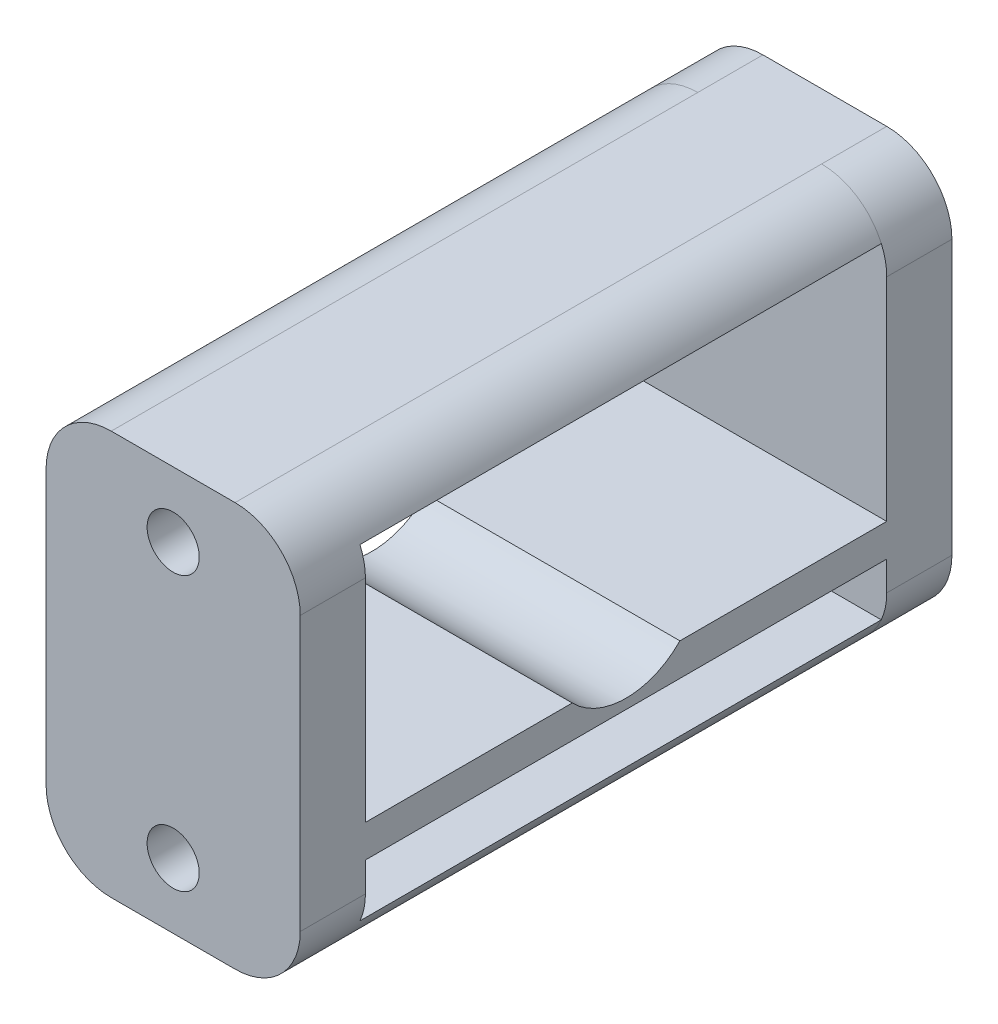
ISO-10303-21;
HEADER;
FILE_DESCRIPTION(('STEP AP214'),'2;1');
FILE_NAME('part.step','',(''),(''),'','','');
FILE_SCHEMA(('AUTOMOTIVE_DESIGN { 1 0 10303 214 1 1 1 1 }'));
ENDSEC;
DATA;
#1=APPLICATION_CONTEXT('core data for automotive mechanical design processes');
#2=APPLICATION_PROTOCOL_DEFINITION('international standard','automotive_design',2000,#1);
#3=PRODUCT_CONTEXT('',#1,'mechanical');
#4=PRODUCT('Part','Part','',(#3));
#5=PRODUCT_RELATED_PRODUCT_CATEGORY('part','',(#4));
#6=PRODUCT_DEFINITION_FORMATION('','',#4);
#7=PRODUCT_DEFINITION_CONTEXT('part definition',#1,'design');
#8=PRODUCT_DEFINITION('design','',#6,#7);
#9=PRODUCT_DEFINITION_SHAPE('','',#8);
#10=(LENGTH_UNIT() NAMED_UNIT(*) SI_UNIT(.MILLI.,.METRE.));
#11=(NAMED_UNIT(*) PLANE_ANGLE_UNIT() SI_UNIT($,.RADIAN.));
#12=(NAMED_UNIT(*) SI_UNIT($,.STERADIAN.) SOLID_ANGLE_UNIT());
#13=UNCERTAINTY_MEASURE_WITH_UNIT(LENGTH_MEASURE(1.E-05),#10,'distance_accuracy_value','');
#14=(GEOMETRIC_REPRESENTATION_CONTEXT(3) GLOBAL_UNCERTAINTY_ASSIGNED_CONTEXT((#13)) GLOBAL_UNIT_ASSIGNED_CONTEXT((#10,
#11,#12)) REPRESENTATION_CONTEXT('',''));
#15=CARTESIAN_POINT('',(0.,0.,0.));
#16=DIRECTION('',(0.,0.,1.));
#17=DIRECTION('',(1.,0.,0.));
#18=AXIS2_PLACEMENT_3D('',#15,#16,#17);
#19=CARTESIAN_POINT('',(19.5,-11.5,9.99999999999999));
#20=DIRECTION('',(0.,-1.,0.));
#21=DIRECTION('',(0.,0.,-1.));
#22=AXIS2_PLACEMENT_3D('',#19,#20,#21);
#23=PLANE('',#22);
#24=DIRECTION('',(0.,0.,1.));
#25=VECTOR('',#24,1.);
#26=CARTESIAN_POINT('',(19.5,-11.5,9.99999999999999));
#27=LINE('',#26,#25);
#28=CARTESIAN_POINT('',(19.5,-11.5,58.2613558209292));
#29=VERTEX_POINT('',#28);
#30=CARTESIAN_POINT('',(19.5,-11.5,90.));
#31=VERTEX_POINT('',#30);
#32=EDGE_CURVE('E409',#29,#31,#27,.T.);
#33=ORIENTED_EDGE('',*,*,#32,.F.);
#34=DIRECTION('',(-1.,0.,0.));
#35=VECTOR('',#34,1.);
#36=CARTESIAN_POINT('',(19.5,-11.5,58.2613558209292));
#37=LINE('',#36,#35);
#38=CARTESIAN_POINT('',(-19.5,-11.5,58.2613558209292));
#39=VERTEX_POINT('',#38);
#40=EDGE_CURVE('E11',#29,#39,#37,.T.);
#41=ORIENTED_EDGE('',*,*,#40,.T.);
#42=DIRECTION('',(0.,0.,1.));
#43=VECTOR('',#42,1.);
#44=CARTESIAN_POINT('',(-19.5,-11.5,9.99999999999999));
#45=LINE('',#44,#43);
#46=CARTESIAN_POINT('',(-19.5,-11.5,90.));
#47=VERTEX_POINT('',#46);
#48=EDGE_CURVE('E222',#39,#47,#45,.T.);
#49=ORIENTED_EDGE('',*,*,#48,.T.);
#50=DIRECTION('',(1.,0.,0.));
#51=VECTOR('',#50,1.);
#52=CARTESIAN_POINT('',(19.5,-11.5,90.));
#53=LINE('',#52,#51);
#54=EDGE_CURVE('E468',#47,#31,#53,.T.);
#55=ORIENTED_EDGE('',*,*,#54,.T.);
#56=EDGE_LOOP('',(#33,#41,#49,#55));
#57=FACE_BOUND('',#56,.T.);
#58=ADVANCED_FACE('F37',(#57),#23,.F.);
#59=CARTESIAN_POINT('',(0.,0.,10.));
#60=DIRECTION('',(0.,0.,1.));
#61=DIRECTION('',(1.,0.,0.));
#62=AXIS2_PLACEMENT_3D('',#59,#60,#61);
#63=PLANE('',#62);
#64=DIRECTION('',(0.,1.,0.));
#65=VECTOR('',#64,1.);
#66=CARTESIAN_POINT('',(19.5,-31.,10.));
#67=LINE('',#66,#65);
#68=CARTESIAN_POINT('',(19.5,-21.,10.));
#69=VERTEX_POINT('',#68);
#70=CARTESIAN_POINT('',(19.5,-16.5,10.));
#71=VERTEX_POINT('',#70);
#72=EDGE_CURVE('E291',#69,#71,#67,.T.);
#73=ORIENTED_EDGE('',*,*,#72,.T.);
#74=DIRECTION('',(-1.,0.,0.));
#75=VECTOR('',#74,1.);
#76=CARTESIAN_POINT('',(19.5,-16.5,9.99999999999999));
#77=LINE('',#76,#75);
#78=CARTESIAN_POINT('',(-19.5,-16.5,10.));
#79=VERTEX_POINT('',#78);
#80=EDGE_CURVE('E470',#71,#79,#77,.T.);
#81=ORIENTED_EDGE('',*,*,#80,.T.);
#82=DIRECTION('',(0.,1.,0.));
#83=VECTOR('',#82,1.);
#84=CARTESIAN_POINT('',(-19.5,-31.,10.));
#85=LINE('',#84,#83);
#86=CARTESIAN_POINT('',(-19.5,-21.,10.));
#87=VERTEX_POINT('',#86);
#88=EDGE_CURVE('E294',#87,#79,#85,.T.);
#89=ORIENTED_EDGE('',*,*,#88,.F.);
#90=CARTESIAN_POINT('',(-9.5,-21.,10.));
#91=DIRECTION('',(0.,0.,1.));
#92=DIRECTION('',(1.,0.,0.));
#93=AXIS2_PLACEMENT_3D('',#90,#91,#92);
#94=CIRCLE('',#93,10.);
#95=CARTESIAN_POINT('',(-18.6651513899117,-25.,10.));
#96=VERTEX_POINT('',#95);
#97=EDGE_CURVE('E337',#87,#96,#94,.T.);
#98=ORIENTED_EDGE('',*,*,#97,.T.);
#99=DIRECTION('',(-1.,0.,0.));
#100=VECTOR('',#99,1.);
#101=CARTESIAN_POINT('',(0.,-25.,10.));
#102=LINE('',#101,#100);
#103=CARTESIAN_POINT('',(0.,-25.,10.));
#104=VERTEX_POINT('',#103);
#105=EDGE_CURVE('E260',#104,#96,#102,.T.);
#106=ORIENTED_EDGE('',*,*,#105,.F.);
#107=CARTESIAN_POINT('',(0.,-21.,10.));
#108=DIRECTION('',(0.,0.,1.));
#109=DIRECTION('',(1.,0.,0.));
#110=AXIS2_PLACEMENT_3D('',#107,#108,#109);
#111=CIRCLE('',#110,4.);
#112=EDGE_CURVE('E286',#104,#104,#111,.T.);
#113=ORIENTED_EDGE('',*,*,#112,.F.);
#114=CARTESIAN_POINT('',(18.6651513899117,-25.,10.));
#115=VERTEX_POINT('',#114);
#116=EDGE_CURVE('E263',#115,#104,#102,.T.);
#117=ORIENTED_EDGE('',*,*,#116,.F.);
#118=CARTESIAN_POINT('',(9.5,-21.,10.));
#119=DIRECTION('',(0.,0.,1.));
#120=DIRECTION('',(1.,0.,0.));
#121=AXIS2_PLACEMENT_3D('',#118,#119,#120);
#122=CIRCLE('',#121,10.);
#123=EDGE_CURVE('E333',#115,#69,#122,.T.);
#124=ORIENTED_EDGE('',*,*,#123,.T.);
#125=EDGE_LOOP('',(#73,#81,#89,#98,#106,#113,#117,#124));
#126=FACE_BOUND('',#125,.T.);
#127=ADVANCED_FACE('F477',(#126),#63,.T.);
#128=CARTESIAN_POINT('',(-19.5,-11.5,10.));
#129=VERTEX_POINT('',#128);
#130=CARTESIAN_POINT('',(-19.5,21.,10.));
#131=VERTEX_POINT('',#130);
#132=EDGE_CURVE('E60',#129,#131,#85,.T.);
#133=ORIENTED_EDGE('',*,*,#132,.F.);
#134=DIRECTION('',(1.,0.,0.));
#135=VECTOR('',#134,1.);
#136=CARTESIAN_POINT('',(19.5,-11.5,9.99999999999999));
#137=LINE('',#136,#135);
#138=CARTESIAN_POINT('',(19.5,-11.5,9.99999999999999));
#139=VERTEX_POINT('',#138);
#140=EDGE_CURVE('E225',#129,#139,#137,.T.);
#141=ORIENTED_EDGE('',*,*,#140,.T.);
#142=CARTESIAN_POINT('',(19.5,21.,10.));
#143=VERTEX_POINT('',#142);
#144=EDGE_CURVE('E293',#139,#143,#67,.T.);
#145=ORIENTED_EDGE('',*,*,#144,.T.);
#146=CARTESIAN_POINT('',(9.5,21.,10.));
#147=DIRECTION('',(0.,0.,1.));
#148=DIRECTION('',(1.,0.,0.));
#149=AXIS2_PLACEMENT_3D('',#146,#147,#148);
#150=CIRCLE('',#149,10.);
#151=CARTESIAN_POINT('',(18.6651513899117,25.,10.));
#152=VERTEX_POINT('',#151);
#153=EDGE_CURVE('E331',#143,#152,#150,.T.);
#154=ORIENTED_EDGE('',*,*,#153,.T.);
#155=DIRECTION('',(1.,0.,0.));
#156=VECTOR('',#155,1.);
#157=CARTESIAN_POINT('',(0.,25.,10.));
#158=LINE('',#157,#156);
#159=CARTESIAN_POINT('',(0.,25.,10.));
#160=VERTEX_POINT('',#159);
#161=EDGE_CURVE('E278',#160,#152,#158,.T.);
#162=ORIENTED_EDGE('',*,*,#161,.F.);
#163=CARTESIAN_POINT('',(0.,21.,10.));
#164=DIRECTION('',(0.,0.,1.));
#165=DIRECTION('',(1.,0.,0.));
#166=AXIS2_PLACEMENT_3D('',#163,#164,#165);
#167=CIRCLE('',#166,4.);
#168=EDGE_CURVE('E283',#160,#160,#167,.T.);
#169=ORIENTED_EDGE('',*,*,#168,.F.);
#170=CARTESIAN_POINT('',(-18.6651513899117,25.,10.));
#171=VERTEX_POINT('',#170);
#172=EDGE_CURVE('E274',#171,#160,#158,.T.);
#173=ORIENTED_EDGE('',*,*,#172,.F.);
#174=CARTESIAN_POINT('',(-9.5,21.,10.));
#175=DIRECTION('',(0.,0.,1.));
#176=DIRECTION('',(1.,0.,0.));
#177=AXIS2_PLACEMENT_3D('',#174,#175,#176);
#178=CIRCLE('',#177,10.);
#179=EDGE_CURVE('E326',#171,#131,#178,.T.);
#180=ORIENTED_EDGE('',*,*,#179,.T.);
#181=EDGE_LOOP('',(#133,#141,#145,#154,#162,#169,#173,#180));
#182=FACE_BOUND('',#181,.T.);
#183=ADVANCED_FACE('F499',(#182),#63,.T.);
#184=CARTESIAN_POINT('',(0.,0.,90.));
#185=DIRECTION('',(0.,0.,-1.));
#186=DIRECTION('',(-1.,0.,0.));
#187=AXIS2_PLACEMENT_3D('',#184,#185,#186);
#188=PLANE('',#187);
#189=DIRECTION('',(0.,-1.,0.));
#190=VECTOR('',#189,1.);
#191=CARTESIAN_POINT('',(-19.5,-31.,90.));
#192=LINE('',#191,#190);
#193=CARTESIAN_POINT('',(-19.5,-16.5,90.));
#194=VERTEX_POINT('',#193);
#195=CARTESIAN_POINT('',(-19.5,-21.,90.));
#196=VERTEX_POINT('',#195);
#197=EDGE_CURVE('E257',#194,#196,#192,.T.);
#198=ORIENTED_EDGE('',*,*,#197,.F.);
#199=DIRECTION('',(-1.,0.,0.));
#200=VECTOR('',#199,1.);
#201=CARTESIAN_POINT('',(19.5,-16.5,90.));
#202=LINE('',#201,#200);
#203=CARTESIAN_POINT('',(19.5,-16.5,90.));
#204=VERTEX_POINT('',#203);
#205=EDGE_CURVE('E465',#204,#194,#202,.T.);
#206=ORIENTED_EDGE('',*,*,#205,.F.);
#207=DIRECTION('',(0.,1.,0.));
#208=VECTOR('',#207,1.);
#209=CARTESIAN_POINT('',(19.5,-31.,90.));
#210=LINE('',#209,#208);
#211=CARTESIAN_POINT('',(19.5,-21.,90.));
#212=VERTEX_POINT('',#211);
#213=EDGE_CURVE('E254',#212,#204,#210,.T.);
#214=ORIENTED_EDGE('',*,*,#213,.F.);
#215=CARTESIAN_POINT('',(9.5,-21.,90.));
#216=DIRECTION('',(0.,0.,-1.));
#217=DIRECTION('',(-1.,0.,0.));
#218=AXIS2_PLACEMENT_3D('',#215,#216,#217);
#219=CIRCLE('',#218,10.);
#220=CARTESIAN_POINT('',(18.6651513899117,-25.,90.));
#221=VERTEX_POINT('',#220);
#222=EDGE_CURVE('E363',#212,#221,#219,.T.);
#223=ORIENTED_EDGE('',*,*,#222,.T.);
#224=DIRECTION('',(-1.,0.,0.));
#225=VECTOR('',#224,1.);
#226=CARTESIAN_POINT('',(-19.5,-25.,90.));
#227=LINE('',#226,#225);
#228=CARTESIAN_POINT('',(0.,-25.,90.));
#229=VERTEX_POINT('',#228);
#230=EDGE_CURVE('E264',#221,#229,#227,.T.);
#231=ORIENTED_EDGE('',*,*,#230,.T.);
#232=CARTESIAN_POINT('',(0.,-21.,90.));
#233=DIRECTION('',(0.,0.,-1.));
#234=DIRECTION('',(-1.,0.,0.));
#235=AXIS2_PLACEMENT_3D('',#232,#233,#234);
#236=CIRCLE('',#235,4.);
#237=EDGE_CURVE('E235',#229,#229,#236,.T.);
#238=ORIENTED_EDGE('',*,*,#237,.F.);
#239=CARTESIAN_POINT('',(-18.6651513899117,-25.,90.));
#240=VERTEX_POINT('',#239);
#241=EDGE_CURVE('E253',#229,#240,#227,.T.);
#242=ORIENTED_EDGE('',*,*,#241,.T.);
#243=CARTESIAN_POINT('',(-9.5,-21.,90.));
#244=DIRECTION('',(0.,0.,-1.));
#245=DIRECTION('',(-1.,0.,0.));
#246=AXIS2_PLACEMENT_3D('',#243,#244,#245);
#247=CIRCLE('',#246,10.);
#248=EDGE_CURVE('E360',#240,#196,#247,.T.);
#249=ORIENTED_EDGE('',*,*,#248,.T.);
#250=EDGE_LOOP('',(#198,#206,#214,#223,#231,#238,#242,#249));
#251=FACE_BOUND('',#250,.T.);
#252=ADVANCED_FACE('F462',(#251),#188,.T.);
#253=CARTESIAN_POINT('',(19.5,21.,90.));
#254=VERTEX_POINT('',#253);
#255=EDGE_CURVE('E258',#31,#254,#210,.T.);
#256=ORIENTED_EDGE('',*,*,#255,.F.);
#257=ORIENTED_EDGE('',*,*,#54,.F.);
#258=CARTESIAN_POINT('',(-19.5,21.,90.));
#259=VERTEX_POINT('',#258);
#260=EDGE_CURVE('E244',#259,#47,#192,.T.);
#261=ORIENTED_EDGE('',*,*,#260,.F.);
#262=CARTESIAN_POINT('',(-9.5,21.,90.));
#263=DIRECTION('',(0.,0.,-1.));
#264=DIRECTION('',(-1.,0.,0.));
#265=AXIS2_PLACEMENT_3D('',#262,#263,#264);
#266=CIRCLE('',#265,10.);
#267=CARTESIAN_POINT('',(-18.6651513899117,25.,90.));
#268=VERTEX_POINT('',#267);
#269=EDGE_CURVE('E355',#259,#268,#266,.T.);
#270=ORIENTED_EDGE('',*,*,#269,.T.);
#271=DIRECTION('',(1.,0.,0.));
#272=VECTOR('',#271,1.);
#273=CARTESIAN_POINT('',(-19.5,25.,90.));
#274=LINE('',#273,#272);
#275=CARTESIAN_POINT('',(0.,25.,90.));
#276=VERTEX_POINT('',#275);
#277=EDGE_CURVE('E270',#268,#276,#274,.T.);
#278=ORIENTED_EDGE('',*,*,#277,.T.);
#279=CARTESIAN_POINT('',(0.,21.,90.));
#280=DIRECTION('',(0.,0.,-1.));
#281=DIRECTION('',(-1.,0.,0.));
#282=AXIS2_PLACEMENT_3D('',#279,#280,#281);
#283=CIRCLE('',#282,4.);
#284=EDGE_CURVE('E236',#276,#276,#283,.T.);
#285=ORIENTED_EDGE('',*,*,#284,.F.);
#286=CARTESIAN_POINT('',(18.6651513899117,25.,90.));
#287=VERTEX_POINT('',#286);
#288=EDGE_CURVE('E269',#276,#287,#274,.T.);
#289=ORIENTED_EDGE('',*,*,#288,.T.);
#290=CARTESIAN_POINT('',(9.5,21.,90.));
#291=DIRECTION('',(0.,0.,-1.));
#292=DIRECTION('',(-1.,0.,0.));
#293=AXIS2_PLACEMENT_3D('',#290,#291,#292);
#294=CIRCLE('',#293,10.);
#295=EDGE_CURVE('E357',#287,#254,#294,.T.);
#296=ORIENTED_EDGE('',*,*,#295,.T.);
#297=EDGE_LOOP('',(#256,#257,#261,#270,#278,#285,#289,#296));
#298=FACE_BOUND('',#297,.T.);
#299=ADVANCED_FACE('F414',(#298),#188,.T.);
#300=CARTESIAN_POINT('',(-19.5,31.,10.));
#301=DIRECTION('',(0.,1.,0.));
#302=DIRECTION('',(0.,0.,1.));
#303=AXIS2_PLACEMENT_3D('',#300,#301,#302);
#304=PLANE('',#303);
#305=DIRECTION('',(-1.,0.,0.));
#306=VECTOR('',#305,1.);
#307=CARTESIAN_POINT('',(-19.5,31.,100.));
#308=LINE('',#307,#306);
#309=CARTESIAN_POINT('',(9.5,31.,100.));
#310=VERTEX_POINT('',#309);
#311=CARTESIAN_POINT('',(-9.5,31.,100.));
#312=VERTEX_POINT('',#311);
#313=EDGE_CURVE('E243',#310,#312,#308,.T.);
#314=ORIENTED_EDGE('',*,*,#313,.F.);
#315=DIRECTION('',(0.,0.,-1.));
#316=VECTOR('',#315,1.);
#317=CARTESIAN_POINT('',(9.5,31.,90.));
#318=LINE('',#317,#316);
#319=CARTESIAN_POINT('',(9.5,31.,10.));
#320=VERTEX_POINT('',#319);
#321=EDGE_CURVE('E390',#310,#320,#318,.T.);
#322=ORIENTED_EDGE('',*,*,#321,.T.);
#323=DIRECTION('',(0.,0.,-1.));
#324=VECTOR('',#323,1.);
#325=CARTESIAN_POINT('',(9.5,31.,0.));
#326=LINE('',#325,#324);
#327=CARTESIAN_POINT('',(9.5,31.,0.));
#328=VERTEX_POINT('',#327);
#329=EDGE_CURVE('E348',#320,#328,#326,.T.);
#330=ORIENTED_EDGE('',*,*,#329,.T.);
#331=DIRECTION('',(1.,0.,0.));
#332=VECTOR('',#331,1.);
#333=CARTESIAN_POINT('',(-19.5,31.,0.));
#334=LINE('',#333,#332);
#335=CARTESIAN_POINT('',(-9.5,31.,0.));
#336=VERTEX_POINT('',#335);
#337=EDGE_CURVE('E282',#336,#328,#334,.T.);
#338=ORIENTED_EDGE('',*,*,#337,.F.);
#339=DIRECTION('',(0.,0.,-1.));
#340=VECTOR('',#339,1.);
#341=CARTESIAN_POINT('',(-9.5,31.,10.));
#342=LINE('',#341,#340);
#343=CARTESIAN_POINT('',(-9.5,31.,10.));
#344=VERTEX_POINT('',#343);
#345=EDGE_CURVE('E346',#336,#344,#342,.F.);
#346=ORIENTED_EDGE('',*,*,#345,.T.);
#347=DIRECTION('',(0.,0.,-1.));
#348=VECTOR('',#347,1.);
#349=CARTESIAN_POINT('',(-9.5,31.,100.));
#350=LINE('',#349,#348);
#351=EDGE_CURVE('E388',#344,#312,#350,.F.);
#352=ORIENTED_EDGE('',*,*,#351,.T.);
#353=EDGE_LOOP('',(#314,#322,#330,#338,#346,#352));
#354=FACE_BOUND('',#353,.T.);
#355=ADVANCED_FACE('F427',(#354),#304,.T.);
#356=CARTESIAN_POINT('',(-19.5,-31.,10.));
#357=DIRECTION('',(-1.,0.,0.));
#358=DIRECTION('',(0.,0.,1.));
#359=AXIS2_PLACEMENT_3D('',#356,#357,#358);
#360=PLANE('',#359);
#361=CARTESIAN_POINT('',(-19.5,-3.5,50.));
#362=DIRECTION('',(-1.,0.,0.));
#363=DIRECTION('',(0.,0.,1.));
#364=AXIS2_PLACEMENT_3D('',#361,#362,#363);
#365=CIRCLE('',#364,11.5);
#366=CARTESIAN_POINT('',(-19.5,-11.5,41.7386441790709));
#367=VERTEX_POINT('',#366);
#368=EDGE_CURVE('E210',#367,#39,#365,.T.);
#369=ORIENTED_EDGE('',*,*,#368,.F.);
#370=EDGE_CURVE('E219',#129,#367,#45,.T.);
#371=ORIENTED_EDGE('',*,*,#370,.F.);
#372=ORIENTED_EDGE('',*,*,#132,.T.);
#373=DIRECTION('',(0.,0.,-1.));
#374=VECTOR('',#373,1.);
#375=CARTESIAN_POINT('',(-19.5,21.,10.));
#376=LINE('',#375,#374);
#377=CARTESIAN_POINT('',(-19.5,21.,0.));
#378=VERTEX_POINT('',#377);
#379=EDGE_CURVE('E321',#131,#378,#376,.T.);
#380=ORIENTED_EDGE('',*,*,#379,.T.);
#381=DIRECTION('',(0.,1.,0.));
#382=VECTOR('',#381,1.);
#383=CARTESIAN_POINT('',(-19.5,-31.,0.));
#384=LINE('',#383,#382);
#385=CARTESIAN_POINT('',(-19.5,-21.,0.));
#386=VERTEX_POINT('',#385);
#387=EDGE_CURVE('E306',#386,#378,#384,.T.);
#388=ORIENTED_EDGE('',*,*,#387,.F.);
#389=DIRECTION('',(0.,0.,-1.));
#390=VECTOR('',#389,1.);
#391=CARTESIAN_POINT('',(-19.5,-21.,10.));
#392=LINE('',#391,#390);
#393=EDGE_CURVE('E324',#386,#87,#392,.F.);
#394=ORIENTED_EDGE('',*,*,#393,.T.);
#395=ORIENTED_EDGE('',*,*,#88,.T.);
#396=DIRECTION('',(0.,0.,1.));
#397=VECTOR('',#396,1.);
#398=CARTESIAN_POINT('',(-19.5,-16.5,9.99999999999999));
#399=LINE('',#398,#397);
#400=EDGE_CURVE('E226',#79,#194,#399,.T.);
#401=ORIENTED_EDGE('',*,*,#400,.T.);
#402=ORIENTED_EDGE('',*,*,#197,.T.);
#403=DIRECTION('',(0.,0.,-1.));
#404=VECTOR('',#403,1.);
#405=CARTESIAN_POINT('',(-19.5,-21.,100.));
#406=LINE('',#405,#404);
#407=CARTESIAN_POINT('',(-19.5,-21.,100.));
#408=VERTEX_POINT('',#407);
#409=EDGE_CURVE('E386',#196,#408,#406,.F.);
#410=ORIENTED_EDGE('',*,*,#409,.T.);
#411=DIRECTION('',(0.,-1.,0.));
#412=VECTOR('',#411,1.);
#413=CARTESIAN_POINT('',(-19.5,-31.,100.));
#414=LINE('',#413,#412);
#415=CARTESIAN_POINT('',(-19.5,21.,100.));
#416=VERTEX_POINT('',#415);
#417=EDGE_CURVE('E247',#416,#408,#414,.T.);
#418=ORIENTED_EDGE('',*,*,#417,.F.);
#419=DIRECTION('',(0.,0.,-1.));
#420=VECTOR('',#419,1.);
#421=CARTESIAN_POINT('',(-19.5,21.,90.));
#422=LINE('',#421,#420);
#423=EDGE_CURVE('E383',#416,#259,#422,.T.);
#424=ORIENTED_EDGE('',*,*,#423,.T.);
#425=ORIENTED_EDGE('',*,*,#260,.T.);
#426=ORIENTED_EDGE('',*,*,#48,.F.);
#427=EDGE_LOOP('',(#369,#371,#372,#380,#388,#394,#395,#401,#402,#410,#418,#424,#425,#426));
#428=FACE_BOUND('',#427,.T.);
#429=ADVANCED_FACE('F218',(#428),#360,.T.);
#430=CARTESIAN_POINT('',(-19.5,-31.,10.));
#431=DIRECTION('',(0.,1.,0.));
#432=DIRECTION('',(0.,0.,1.));
#433=AXIS2_PLACEMENT_3D('',#430,#431,#432);
#434=PLANE('',#433);
#435=DIRECTION('',(0.,0.,-1.));
#436=VECTOR('',#435,1.);
#437=CARTESIAN_POINT('',(9.5,-31.,10.));
#438=LINE('',#437,#436);
#439=CARTESIAN_POINT('',(9.5,-31.,0.));
#440=VERTEX_POINT('',#439);
#441=CARTESIAN_POINT('',(9.5,-31.,10.));
#442=VERTEX_POINT('',#441);
#443=EDGE_CURVE('E297',#440,#442,#438,.F.);
#444=ORIENTED_EDGE('',*,*,#443,.T.);
#445=DIRECTION('',(0.,0.,-1.));
#446=VECTOR('',#445,1.);
#447=CARTESIAN_POINT('',(9.5,-31.,10.));
#448=LINE('',#447,#446);
#449=CARTESIAN_POINT('',(9.5,-31.,100.));
#450=VERTEX_POINT('',#449);
#451=EDGE_CURVE('E373',#442,#450,#448,.F.);
#452=ORIENTED_EDGE('',*,*,#451,.T.);
#453=DIRECTION('',(1.,0.,0.));
#454=VECTOR('',#453,1.);
#455=CARTESIAN_POINT('',(-19.5,-31.,100.));
#456=LINE('',#455,#454);
#457=CARTESIAN_POINT('',(-9.5,-31.,100.));
#458=VERTEX_POINT('',#457);
#459=EDGE_CURVE('E250',#458,#450,#456,.T.);
#460=ORIENTED_EDGE('',*,*,#459,.F.);
#461=DIRECTION('',(0.,0.,-1.));
#462=VECTOR('',#461,1.);
#463=CARTESIAN_POINT('',(-9.5,-31.,10.));
#464=LINE('',#463,#462);
#465=CARTESIAN_POINT('',(-9.5,-31.,10.));
#466=VERTEX_POINT('',#465);
#467=EDGE_CURVE('E370',#458,#466,#464,.T.);
#468=ORIENTED_EDGE('',*,*,#467,.T.);
#469=DIRECTION('',(0.,0.,-1.));
#470=VECTOR('',#469,1.);
#471=CARTESIAN_POINT('',(-9.5,-31.,0.));
#472=LINE('',#471,#470);
#473=CARTESIAN_POINT('',(-9.5,-31.,0.));
#474=VERTEX_POINT('',#473);
#475=EDGE_CURVE('E310',#466,#474,#472,.T.);
#476=ORIENTED_EDGE('',*,*,#475,.T.);
#477=DIRECTION('',(1.,0.,0.));
#478=VECTOR('',#477,1.);
#479=CARTESIAN_POINT('',(-19.5,-31.,0.));
#480=LINE('',#479,#478);
#481=EDGE_CURVE('E303',#474,#440,#480,.T.);
#482=ORIENTED_EDGE('',*,*,#481,.T.);
#483=EDGE_LOOP('',(#444,#452,#460,#468,#476,#482));
#484=FACE_BOUND('',#483,.T.);
#485=ADVANCED_FACE('F449',(#484),#434,.F.);
#486=CARTESIAN_POINT('',(19.5,-31.,10.));
#487=DIRECTION('',(-1.,0.,0.));
#488=DIRECTION('',(0.,0.,1.));
#489=AXIS2_PLACEMENT_3D('',#486,#487,#488);
#490=PLANE('',#489);
#491=CARTESIAN_POINT('',(19.5,-11.5,41.7386441790709));
#492=VERTEX_POINT('',#491);
#493=EDGE_CURVE('E230',#139,#492,#27,.T.);
#494=ORIENTED_EDGE('',*,*,#493,.T.);
#495=CARTESIAN_POINT('',(19.5,-3.5,50.));
#496=DIRECTION('',(-1.,0.,0.));
#497=DIRECTION('',(0.,0.,1.));
#498=AXIS2_PLACEMENT_3D('',#495,#496,#497);
#499=CIRCLE('',#498,11.5);
#500=EDGE_CURVE('E52',#492,#29,#499,.T.);
#501=ORIENTED_EDGE('',*,*,#500,.T.);
#502=ORIENTED_EDGE('',*,*,#32,.T.);
#503=ORIENTED_EDGE('',*,*,#255,.T.);
#504=DIRECTION('',(0.,0.,-1.));
#505=VECTOR('',#504,1.);
#506=CARTESIAN_POINT('',(19.5,21.,100.));
#507=LINE('',#506,#505);
#508=CARTESIAN_POINT('',(19.5,21.,100.));
#509=VERTEX_POINT('',#508);
#510=EDGE_CURVE('E277',#254,#509,#507,.F.);
#511=ORIENTED_EDGE('',*,*,#510,.T.);
#512=DIRECTION('',(0.,1.,0.));
#513=VECTOR('',#512,1.);
#514=CARTESIAN_POINT('',(19.5,-31.,100.));
#515=LINE('',#514,#513);
#516=CARTESIAN_POINT('',(19.5,-21.,100.));
#517=VERTEX_POINT('',#516);
#518=EDGE_CURVE('E240',#517,#509,#515,.T.);
#519=ORIENTED_EDGE('',*,*,#518,.F.);
#520=DIRECTION('',(0.,0.,-1.));
#521=VECTOR('',#520,1.);
#522=CARTESIAN_POINT('',(19.5,-21.,100.));
#523=LINE('',#522,#521);
#524=EDGE_CURVE('E352',#517,#212,#523,.T.);
#525=ORIENTED_EDGE('',*,*,#524,.T.);
#526=ORIENTED_EDGE('',*,*,#213,.T.);
#527=DIRECTION('',(0.,0.,1.));
#528=VECTOR('',#527,1.);
#529=CARTESIAN_POINT('',(19.5,-16.5,9.99999999999999));
#530=LINE('',#529,#528);
#531=EDGE_CURVE('E228',#71,#204,#530,.T.);
#532=ORIENTED_EDGE('',*,*,#531,.F.);
#533=ORIENTED_EDGE('',*,*,#72,.F.);
#534=DIRECTION('',(0.,0.,-1.));
#535=VECTOR('',#534,1.);
#536=CARTESIAN_POINT('',(19.5,-21.,10.));
#537=LINE('',#536,#535);
#538=CARTESIAN_POINT('',(19.5,-21.,0.));
#539=VERTEX_POINT('',#538);
#540=EDGE_CURVE('E343',#69,#539,#537,.T.);
#541=ORIENTED_EDGE('',*,*,#540,.T.);
#542=DIRECTION('',(0.,1.,0.));
#543=VECTOR('',#542,1.);
#544=CARTESIAN_POINT('',(19.5,-31.,0.));
#545=LINE('',#544,#543);
#546=CARTESIAN_POINT('',(19.5,21.,0.));
#547=VERTEX_POINT('',#546);
#548=EDGE_CURVE('E300',#539,#547,#545,.T.);
#549=ORIENTED_EDGE('',*,*,#548,.T.);
#550=DIRECTION('',(0.,0.,-1.));
#551=VECTOR('',#550,1.);
#552=CARTESIAN_POINT('',(19.5,21.,10.));
#553=LINE('',#552,#551);
#554=EDGE_CURVE('E340',#547,#143,#553,.F.);
#555=ORIENTED_EDGE('',*,*,#554,.T.);
#556=ORIENTED_EDGE('',*,*,#144,.F.);
#557=EDGE_LOOP('',(#494,#501,#502,#503,#511,#519,#525,#526,#532,#533,#541,#549,#555,#556));
#558=FACE_BOUND('',#557,.T.);
#559=ADVANCED_FACE('F405',(#558),#490,.F.);
#560=CARTESIAN_POINT('',(0.,0.,0.));
#561=DIRECTION('',(0.,0.,1.));
#562=DIRECTION('',(1.,0.,0.));
#563=AXIS2_PLACEMENT_3D('',#560,#561,#562);
#564=PLANE('',#563);
#565=CARTESIAN_POINT('',(0.,21.,0.));
#566=DIRECTION('',(0.,0.,1.));
#567=DIRECTION('',(1.,0.,0.));
#568=AXIS2_PLACEMENT_3D('',#565,#566,#567);
#569=CIRCLE('',#568,4.);
#570=CARTESIAN_POINT('',(4.,21.,0.));
#571=VERTEX_POINT('',#570);
#572=EDGE_CURVE('E279',#571,#571,#569,.T.);
#573=ORIENTED_EDGE('',*,*,#572,.T.);
#574=EDGE_LOOP('',(#573));
#575=FACE_BOUND('',#574,.T.);
#576=CARTESIAN_POINT('',(0.,-21.,0.));
#577=DIRECTION('',(0.,0.,1.));
#578=DIRECTION('',(1.,0.,0.));
#579=AXIS2_PLACEMENT_3D('',#576,#577,#578);
#580=CIRCLE('',#579,4.);
#581=CARTESIAN_POINT('',(4.,-21.,0.));
#582=VERTEX_POINT('',#581);
#583=EDGE_CURVE('E273',#582,#582,#580,.T.);
#584=ORIENTED_EDGE('',*,*,#583,.T.);
#585=EDGE_LOOP('',(#584));
#586=FACE_BOUND('',#585,.T.);
#587=ORIENTED_EDGE('',*,*,#481,.F.);
#588=CARTESIAN_POINT('',(-9.5,-21.,0.));
#589=DIRECTION('',(0.,0.,1.));
#590=DIRECTION('',(1.,0.,0.));
#591=AXIS2_PLACEMENT_3D('',#588,#589,#590);
#592=CIRCLE('',#591,10.);
#593=EDGE_CURVE('E319',#474,#386,#592,.F.);
#594=ORIENTED_EDGE('',*,*,#593,.T.);
#595=ORIENTED_EDGE('',*,*,#387,.T.);
#596=CARTESIAN_POINT('',(-9.5,21.,0.));
#597=DIRECTION('',(0.,0.,1.));
#598=DIRECTION('',(1.,0.,0.));
#599=AXIS2_PLACEMENT_3D('',#596,#597,#598);
#600=CIRCLE('',#599,10.);
#601=EDGE_CURVE('E313',#378,#336,#600,.F.);
#602=ORIENTED_EDGE('',*,*,#601,.T.);
#603=ORIENTED_EDGE('',*,*,#337,.T.);
#604=CARTESIAN_POINT('',(9.5,21.,0.));
#605=DIRECTION('',(0.,0.,1.));
#606=DIRECTION('',(1.,0.,0.));
#607=AXIS2_PLACEMENT_3D('',#604,#605,#606);
#608=CIRCLE('',#607,10.);
#609=EDGE_CURVE('E315',#328,#547,#608,.F.);
#610=ORIENTED_EDGE('',*,*,#609,.T.);
#611=ORIENTED_EDGE('',*,*,#548,.F.);
#612=CARTESIAN_POINT('',(9.5,-21.,0.));
#613=DIRECTION('',(0.,0.,1.));
#614=DIRECTION('',(1.,0.,0.));
#615=AXIS2_PLACEMENT_3D('',#612,#613,#614);
#616=CIRCLE('',#615,10.);
#617=EDGE_CURVE('E317',#539,#440,#616,.F.);
#618=ORIENTED_EDGE('',*,*,#617,.T.);
#619=EDGE_LOOP('',(#587,#594,#595,#602,#603,#610,#611,#618));
#620=FACE_BOUND('',#619,.T.);
#621=ADVANCED_FACE('F521',(#575,#586,#620),#564,.F.);
#622=CARTESIAN_POINT('',(0.,-21.,0.));
#623=DIRECTION('',(0.,0.,1.));
#624=DIRECTION('',(1.,0.,0.));
#625=AXIS2_PLACEMENT_3D('',#622,#623,#624);
#626=CYLINDRICAL_SURFACE('',#625,4.);
#627=ORIENTED_EDGE('',*,*,#583,.F.);
#628=EDGE_LOOP('',(#627));
#629=FACE_BOUND('',#628,.T.);
#630=ORIENTED_EDGE('',*,*,#112,.T.);
#631=EDGE_LOOP('',(#630));
#632=FACE_BOUND('',#631,.T.);
#633=ADVANCED_FACE('F724',(#629,#632),#626,.F.);
#634=CARTESIAN_POINT('',(0.,21.,0.));
#635=DIRECTION('',(0.,0.,1.));
#636=DIRECTION('',(1.,0.,0.));
#637=AXIS2_PLACEMENT_3D('',#634,#635,#636);
#638=CYLINDRICAL_SURFACE('',#637,4.);
#639=ORIENTED_EDGE('',*,*,#572,.F.);
#640=EDGE_LOOP('',(#639));
#641=FACE_BOUND('',#640,.T.);
#642=ORIENTED_EDGE('',*,*,#168,.T.);
#643=EDGE_LOOP('',(#642));
#644=FACE_BOUND('',#643,.T.);
#645=ADVANCED_FACE('F700',(#641,#644),#638,.F.);
#646=CARTESIAN_POINT('',(-9.5,-21.,10.));
#647=DIRECTION('',(0.,0.,1.));
#648=DIRECTION('',(1.,0.,0.));
#649=AXIS2_PLACEMENT_3D('',#646,#647,#648);
#650=CYLINDRICAL_SURFACE('',#649,10.);
#651=ORIENTED_EDGE('',*,*,#97,.F.);
#652=ORIENTED_EDGE('',*,*,#393,.F.);
#653=ORIENTED_EDGE('',*,*,#593,.F.);
#654=ORIENTED_EDGE('',*,*,#475,.F.);
#655=CARTESIAN_POINT('',(-9.5,-21.,10.));
#656=DIRECTION('',(0.,0.,-1.));
#657=DIRECTION('',(-1.,0.,0.));
#658=AXIS2_PLACEMENT_3D('',#655,#656,#657);
#659=CIRCLE('',#658,10.);
#660=EDGE_CURVE('E267',#96,#466,#659,.F.);
#661=ORIENTED_EDGE('',*,*,#660,.F.);
#662=EDGE_LOOP('',(#651,#652,#653,#654,#661));
#663=FACE_BOUND('',#662,.T.);
#664=ADVANCED_FACE('F689',(#663),#650,.T.);
#665=CARTESIAN_POINT('',(9.5,-21.,10.));
#666=DIRECTION('',(0.,0.,-1.));
#667=DIRECTION('',(-1.,0.,0.));
#668=AXIS2_PLACEMENT_3D('',#665,#666,#667);
#669=CYLINDRICAL_SURFACE('',#668,10.);
#670=EDGE_CURVE('E334',#442,#115,#122,.T.);
#671=ORIENTED_EDGE('',*,*,#670,.F.);
#672=ORIENTED_EDGE('',*,*,#443,.F.);
#673=ORIENTED_EDGE('',*,*,#617,.F.);
#674=ORIENTED_EDGE('',*,*,#540,.F.);
#675=ORIENTED_EDGE('',*,*,#123,.F.);
#676=EDGE_LOOP('',(#671,#672,#673,#674,#675));
#677=FACE_BOUND('',#676,.T.);
#678=ADVANCED_FACE('F678',(#677),#669,.T.);
#679=CARTESIAN_POINT('',(9.5,21.,10.));
#680=DIRECTION('',(0.,0.,1.));
#681=DIRECTION('',(1.,0.,0.));
#682=AXIS2_PLACEMENT_3D('',#679,#680,#681);
#683=CYLINDRICAL_SURFACE('',#682,10.);
#684=ORIENTED_EDGE('',*,*,#153,.F.);
#685=ORIENTED_EDGE('',*,*,#554,.F.);
#686=ORIENTED_EDGE('',*,*,#609,.F.);
#687=ORIENTED_EDGE('',*,*,#329,.F.);
#688=EDGE_CURVE('E330',#152,#320,#150,.T.);
#689=ORIENTED_EDGE('',*,*,#688,.F.);
#690=EDGE_LOOP('',(#684,#685,#686,#687,#689));
#691=FACE_BOUND('',#690,.T.);
#692=ADVANCED_FACE('F666',(#691),#683,.T.);
#693=CARTESIAN_POINT('',(-9.5,21.,10.));
#694=DIRECTION('',(0.,0.,-1.));
#695=DIRECTION('',(-1.,0.,0.));
#696=AXIS2_PLACEMENT_3D('',#693,#694,#695);
#697=CYLINDRICAL_SURFACE('',#696,10.);
#698=EDGE_CURVE('E327',#344,#171,#178,.T.);
#699=ORIENTED_EDGE('',*,*,#698,.F.);
#700=ORIENTED_EDGE('',*,*,#345,.F.);
#701=ORIENTED_EDGE('',*,*,#601,.F.);
#702=ORIENTED_EDGE('',*,*,#379,.F.);
#703=ORIENTED_EDGE('',*,*,#179,.F.);
#704=EDGE_LOOP('',(#699,#700,#701,#702,#703));
#705=FACE_BOUND('',#704,.T.);
#706=ADVANCED_FACE('F625',(#705),#697,.T.);
#707=CARTESIAN_POINT('',(0.,25.,90.));
#708=DIRECTION('',(0.,1.,0.));
#709=DIRECTION('',(0.,0.,1.));
#710=AXIS2_PLACEMENT_3D('',#707,#708,#709);
#711=PLANE('',#710);
#712=ORIENTED_EDGE('',*,*,#161,.T.);
#713=DIRECTION('',(0.,0.,1.));
#714=VECTOR('',#713,1.);
#715=CARTESIAN_POINT('',(18.6651513899117,25.,10.));
#716=LINE('',#715,#714);
#717=EDGE_CURVE('E215',#152,#287,#716,.T.);
#718=ORIENTED_EDGE('',*,*,#717,.T.);
#719=ORIENTED_EDGE('',*,*,#288,.F.);
#720=ORIENTED_EDGE('',*,*,#277,.F.);
#721=DIRECTION('',(0.,0.,1.));
#722=VECTOR('',#721,1.);
#723=CARTESIAN_POINT('',(-18.6651513899117,25.,90.));
#724=LINE('',#723,#722);
#725=EDGE_CURVE('E393',#268,#171,#724,.F.);
#726=ORIENTED_EDGE('',*,*,#725,.T.);
#727=ORIENTED_EDGE('',*,*,#172,.T.);
#728=EDGE_LOOP('',(#712,#718,#719,#720,#726,#727));
#729=FACE_BOUND('',#728,.T.);
#730=ADVANCED_FACE('F613',(#729),#711,.F.);
#731=CARTESIAN_POINT('',(0.,-25.,90.));
#732=DIRECTION('',(0.,-1.,0.));
#733=DIRECTION('',(0.,0.,-1.));
#734=AXIS2_PLACEMENT_3D('',#731,#732,#733);
#735=PLANE('',#734);
#736=ORIENTED_EDGE('',*,*,#230,.F.);
#737=DIRECTION('',(0.,0.,-1.));
#738=VECTOR('',#737,1.);
#739=CARTESIAN_POINT('',(18.6651513899117,-25.,90.));
#740=LINE('',#739,#738);
#741=EDGE_CURVE('E368',#221,#115,#740,.T.);
#742=ORIENTED_EDGE('',*,*,#741,.T.);
#743=ORIENTED_EDGE('',*,*,#116,.T.);
#744=ORIENTED_EDGE('',*,*,#105,.T.);
#745=DIRECTION('',(0.,0.,-1.));
#746=VECTOR('',#745,1.);
#747=CARTESIAN_POINT('',(-18.6651513899117,-25.,10.));
#748=LINE('',#747,#746);
#749=EDGE_CURVE('E365',#96,#240,#748,.F.);
#750=ORIENTED_EDGE('',*,*,#749,.T.);
#751=ORIENTED_EDGE('',*,*,#241,.F.);
#752=EDGE_LOOP('',(#736,#742,#743,#744,#750,#751));
#753=FACE_BOUND('',#752,.T.);
#754=ADVANCED_FACE('F600',(#753),#735,.F.);
#755=CARTESIAN_POINT('',(0.,0.,100.));
#756=DIRECTION('',(0.,0.,-1.));
#757=DIRECTION('',(-1.,0.,0.));
#758=AXIS2_PLACEMENT_3D('',#755,#756,#757);
#759=PLANE('',#758);
#760=CARTESIAN_POINT('',(0.,21.,100.));
#761=DIRECTION('',(0.,0.,-1.));
#762=DIRECTION('',(-1.,0.,0.));
#763=AXIS2_PLACEMENT_3D('',#760,#761,#762);
#764=CIRCLE('',#763,4.);
#765=CARTESIAN_POINT('',(-4.,21.,100.));
#766=VERTEX_POINT('',#765);
#767=EDGE_CURVE('E399',#766,#766,#764,.T.);
#768=ORIENTED_EDGE('',*,*,#767,.T.);
#769=EDGE_LOOP('',(#768));
#770=FACE_BOUND('',#769,.T.);
#771=CARTESIAN_POINT('',(0.,-21.,100.));
#772=DIRECTION('',(0.,0.,-1.));
#773=DIRECTION('',(-1.,0.,0.));
#774=AXIS2_PLACEMENT_3D('',#771,#772,#773);
#775=CIRCLE('',#774,4.);
#776=CARTESIAN_POINT('',(-4.,-21.,100.));
#777=VERTEX_POINT('',#776);
#778=EDGE_CURVE('E238',#777,#777,#775,.T.);
#779=ORIENTED_EDGE('',*,*,#778,.T.);
#780=EDGE_LOOP('',(#779));
#781=FACE_BOUND('',#780,.T.);
#782=ORIENTED_EDGE('',*,*,#459,.T.);
#783=CARTESIAN_POINT('',(9.5,-21.,100.));
#784=DIRECTION('',(0.,0.,-1.));
#785=DIRECTION('',(-1.,0.,0.));
#786=AXIS2_PLACEMENT_3D('',#783,#784,#785);
#787=CIRCLE('',#786,10.);
#788=EDGE_CURVE('E381',#450,#517,#787,.F.);
#789=ORIENTED_EDGE('',*,*,#788,.T.);
#790=ORIENTED_EDGE('',*,*,#518,.T.);
#791=CARTESIAN_POINT('',(9.5,21.,100.));
#792=DIRECTION('',(0.,0.,-1.));
#793=DIRECTION('',(-1.,0.,0.));
#794=AXIS2_PLACEMENT_3D('',#791,#792,#793);
#795=CIRCLE('',#794,10.);
#796=EDGE_CURVE('E377',#509,#310,#795,.F.);
#797=ORIENTED_EDGE('',*,*,#796,.T.);
#798=ORIENTED_EDGE('',*,*,#313,.T.);
#799=CARTESIAN_POINT('',(-9.5,21.,100.));
#800=DIRECTION('',(0.,0.,-1.));
#801=DIRECTION('',(-1.,0.,0.));
#802=AXIS2_PLACEMENT_3D('',#799,#800,#801);
#803=CIRCLE('',#802,10.);
#804=EDGE_CURVE('E375',#312,#416,#803,.F.);
#805=ORIENTED_EDGE('',*,*,#804,.T.);
#806=ORIENTED_EDGE('',*,*,#417,.T.);
#807=CARTESIAN_POINT('',(-9.5,-21.,100.));
#808=DIRECTION('',(0.,0.,-1.));
#809=DIRECTION('',(-1.,0.,0.));
#810=AXIS2_PLACEMENT_3D('',#807,#808,#809);
#811=CIRCLE('',#810,10.);
#812=EDGE_CURVE('E379',#408,#458,#811,.F.);
#813=ORIENTED_EDGE('',*,*,#812,.T.);
#814=EDGE_LOOP('',(#782,#789,#790,#797,#798,#805,#806,#813));
#815=FACE_BOUND('',#814,.T.);
#816=ADVANCED_FACE('F424',(#770,#781,#815),#759,.F.);
#817=CARTESIAN_POINT('',(9.5,-21.,100.));
#818=DIRECTION('',(0.,0.,-1.));
#819=DIRECTION('',(-1.,0.,0.));
#820=AXIS2_PLACEMENT_3D('',#817,#818,#819);
#821=CYLINDRICAL_SURFACE('',#820,10.);
#822=ORIENTED_EDGE('',*,*,#788,.F.);
#823=ORIENTED_EDGE('',*,*,#451,.F.);
#824=ORIENTED_EDGE('',*,*,#670,.T.);
#825=ORIENTED_EDGE('',*,*,#741,.F.);
#826=ORIENTED_EDGE('',*,*,#222,.F.);
#827=ORIENTED_EDGE('',*,*,#524,.F.);
#828=EDGE_LOOP('',(#822,#823,#824,#825,#826,#827));
#829=FACE_BOUND('',#828,.T.);
#830=ADVANCED_FACE('F455',(#829),#821,.T.);
#831=CARTESIAN_POINT('',(-9.5,-21.,10.));
#832=DIRECTION('',(0.,0.,-1.));
#833=DIRECTION('',(-1.,0.,0.));
#834=AXIS2_PLACEMENT_3D('',#831,#832,#833);
#835=CYLINDRICAL_SURFACE('',#834,10.);
#836=ORIENTED_EDGE('',*,*,#812,.F.);
#837=ORIENTED_EDGE('',*,*,#409,.F.);
#838=ORIENTED_EDGE('',*,*,#248,.F.);
#839=ORIENTED_EDGE('',*,*,#749,.F.);
#840=ORIENTED_EDGE('',*,*,#660,.T.);
#841=ORIENTED_EDGE('',*,*,#467,.F.);
#842=EDGE_LOOP('',(#836,#837,#838,#839,#840,#841));
#843=FACE_BOUND('',#842,.T.);
#844=ADVANCED_FACE('F443',(#843),#835,.T.);
#845=CARTESIAN_POINT('',(9.5,21.,10.));
#846=DIRECTION('',(0.,0.,1.));
#847=DIRECTION('',(1.,0.,0.));
#848=AXIS2_PLACEMENT_3D('',#845,#846,#847);
#849=CYLINDRICAL_SURFACE('',#848,10.);
#850=ORIENTED_EDGE('',*,*,#796,.F.);
#851=ORIENTED_EDGE('',*,*,#510,.F.);
#852=ORIENTED_EDGE('',*,*,#295,.F.);
#853=ORIENTED_EDGE('',*,*,#717,.F.);
#854=ORIENTED_EDGE('',*,*,#688,.T.);
#855=ORIENTED_EDGE('',*,*,#321,.F.);
#856=EDGE_LOOP('',(#850,#851,#852,#853,#854,#855));
#857=FACE_BOUND('',#856,.T.);
#858=ADVANCED_FACE('F420',(#857),#849,.T.);
#859=CARTESIAN_POINT('',(-9.5,21.,100.));
#860=DIRECTION('',(0.,0.,1.));
#861=DIRECTION('',(1.,0.,0.));
#862=AXIS2_PLACEMENT_3D('',#859,#860,#861);
#863=CYLINDRICAL_SURFACE('',#862,10.);
#864=ORIENTED_EDGE('',*,*,#804,.F.);
#865=ORIENTED_EDGE('',*,*,#351,.F.);
#866=ORIENTED_EDGE('',*,*,#698,.T.);
#867=ORIENTED_EDGE('',*,*,#725,.F.);
#868=ORIENTED_EDGE('',*,*,#269,.F.);
#869=ORIENTED_EDGE('',*,*,#423,.F.);
#870=EDGE_LOOP('',(#864,#865,#866,#867,#868,#869));
#871=FACE_BOUND('',#870,.T.);
#872=ADVANCED_FACE('F39',(#871),#863,.T.);
#873=CARTESIAN_POINT('',(0.,-21.,190.));
#874=DIRECTION('',(0.,0.,-1.));
#875=DIRECTION('',(-1.,0.,0.));
#876=AXIS2_PLACEMENT_3D('',#873,#874,#875);
#877=CYLINDRICAL_SURFACE('',#876,4.);
#878=ORIENTED_EDGE('',*,*,#237,.T.);
#879=EDGE_LOOP('',(#878));
#880=FACE_BOUND('',#879,.T.);
#881=ORIENTED_EDGE('',*,*,#778,.F.);
#882=EDGE_LOOP('',(#881));
#883=FACE_BOUND('',#882,.T.);
#884=ADVANCED_FACE('F491',(#880,#883),#877,.F.);
#885=CARTESIAN_POINT('',(0.,21.,190.));
#886=DIRECTION('',(0.,0.,-1.));
#887=DIRECTION('',(-1.,0.,0.));
#888=AXIS2_PLACEMENT_3D('',#885,#886,#887);
#889=CYLINDRICAL_SURFACE('',#888,4.);
#890=ORIENTED_EDGE('',*,*,#284,.T.);
#891=EDGE_LOOP('',(#890));
#892=FACE_BOUND('',#891,.T.);
#893=ORIENTED_EDGE('',*,*,#767,.F.);
#894=EDGE_LOOP('',(#893));
#895=FACE_BOUND('',#894,.T.);
#896=ADVANCED_FACE('F484',(#892,#895),#889,.F.);
#897=CARTESIAN_POINT('',(19.5,-16.5,9.99999999999999));
#898=DIRECTION('',(0.,1.,0.));
#899=DIRECTION('',(0.,0.,1.));
#900=AXIS2_PLACEMENT_3D('',#897,#898,#899);
#901=PLANE('',#900);
#902=ORIENTED_EDGE('',*,*,#205,.T.);
#903=ORIENTED_EDGE('',*,*,#400,.F.);
#904=ORIENTED_EDGE('',*,*,#80,.F.);
#905=ORIENTED_EDGE('',*,*,#531,.T.);
#906=EDGE_LOOP('',(#902,#903,#904,#905));
#907=FACE_BOUND('',#906,.T.);
#908=ADVANCED_FACE('F482',(#907),#901,.F.);
#909=ORIENTED_EDGE('',*,*,#370,.T.);
#910=DIRECTION('',(-1.,0.,0.));
#911=VECTOR('',#910,1.);
#912=CARTESIAN_POINT('',(19.5,-11.5,41.7386441790709));
#913=LINE('',#912,#911);
#914=EDGE_CURVE('E45',#367,#492,#913,.F.);
#915=ORIENTED_EDGE('',*,*,#914,.T.);
#916=ORIENTED_EDGE('',*,*,#493,.F.);
#917=ORIENTED_EDGE('',*,*,#140,.F.);
#918=EDGE_LOOP('',(#909,#915,#916,#917));
#919=FACE_BOUND('',#918,.T.);
#920=ADVANCED_FACE('F224',(#919),#23,.F.);
#921=CARTESIAN_POINT('',(19.5,-3.5,50.));
#922=DIRECTION('',(-1.,0.,0.));
#923=DIRECTION('',(0.,0.,1.));
#924=AXIS2_PLACEMENT_3D('',#921,#922,#923);
#925=CYLINDRICAL_SURFACE('',#924,11.5);
#926=ORIENTED_EDGE('',*,*,#500,.F.);
#927=ORIENTED_EDGE('',*,*,#914,.F.);
#928=ORIENTED_EDGE('',*,*,#368,.T.);
#929=ORIENTED_EDGE('',*,*,#40,.F.);
#930=EDGE_LOOP('',(#926,#927,#928,#929));
#931=FACE_BOUND('',#930,.T.);
#932=ADVANCED_FACE('F209',(#931),#925,.F.);
#933=CLOSED_SHELL('',(#58,#127,#183,#252,#299,#355,#429,#485,#559,#621,#633,#645,#664,#678,#692,
#706,#730,#754,#816,#830,#844,#858,#872,#884,#896,#908,#920,#932));
#934=MANIFOLD_SOLID_BREP('B2',#933);
#935=ADVANCED_BREP_SHAPE_REPRESENTATION('',(#18,#934),#14);
#936=SHAPE_DEFINITION_REPRESENTATION(#9,#935);
ENDSEC;
END-ISO-10303-21;
